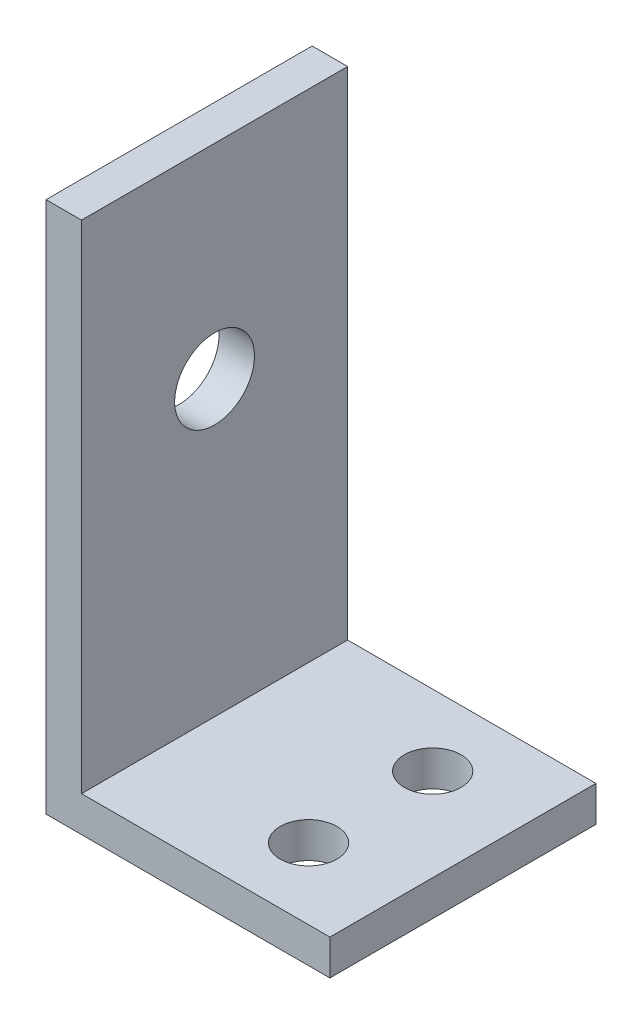
ISO-10303-21;
HEADER;
FILE_DESCRIPTION(('STEP AP214'),'2;1');
FILE_NAME('part.step','',(''),(''),'','','');
FILE_SCHEMA(('AUTOMOTIVE_DESIGN { 1 0 10303 214 1 1 1 1 }'));
ENDSEC;
DATA;
#1=APPLICATION_CONTEXT('core data for automotive mechanical design processes');
#2=APPLICATION_PROTOCOL_DEFINITION('international standard','automotive_design',2000,#1);
#3=PRODUCT_CONTEXT('',#1,'mechanical');
#4=PRODUCT('Part','Part','',(#3));
#5=PRODUCT_RELATED_PRODUCT_CATEGORY('part','',(#4));
#6=PRODUCT_DEFINITION_FORMATION('','',#4);
#7=PRODUCT_DEFINITION_CONTEXT('part definition',#1,'design');
#8=PRODUCT_DEFINITION('design','',#6,#7);
#9=PRODUCT_DEFINITION_SHAPE('','',#8);
#10=(LENGTH_UNIT() NAMED_UNIT(*) SI_UNIT(.MILLI.,.METRE.));
#11=(NAMED_UNIT(*) PLANE_ANGLE_UNIT() SI_UNIT($,.RADIAN.));
#12=(NAMED_UNIT(*) SI_UNIT($,.STERADIAN.) SOLID_ANGLE_UNIT());
#13=UNCERTAINTY_MEASURE_WITH_UNIT(LENGTH_MEASURE(1.E-05),#10,'distance_accuracy_value','');
#14=(GEOMETRIC_REPRESENTATION_CONTEXT(3) GLOBAL_UNCERTAINTY_ASSIGNED_CONTEXT((#13)) GLOBAL_UNIT_ASSIGNED_CONTEXT((#10,
#11,#12)) REPRESENTATION_CONTEXT('',''));
#15=CARTESIAN_POINT('',(0.,0.,0.));
#16=DIRECTION('',(0.,0.,1.));
#17=DIRECTION('',(1.,0.,0.));
#18=AXIS2_PLACEMENT_3D('',#15,#16,#17);
#19=CARTESIAN_POINT('',(-3.8235294117647,2.,-10.0882352941177));
#20=DIRECTION('',(1.,0.,0.));
#21=DIRECTION('',(0.,0.,-1.));
#22=AXIS2_PLACEMENT_3D('',#19,#20,#21);
#23=PLANE('',#22);
#24=CARTESIAN_POINT('',(-3.8235294117647,18.5,-2.58823529411765));
#25=DIRECTION('',(1.,0.,0.));
#26=DIRECTION('',(0.,0.,-1.));
#27=AXIS2_PLACEMENT_3D('',#24,#25,#26);
#28=CIRCLE('',#27,2.25);
#29=CARTESIAN_POINT('',(-3.8235294117647,18.5,-4.83823529411765));
#30=VERTEX_POINT('',#29);
#31=EDGE_CURVE('E164',#30,#30,#28,.T.);
#32=ORIENTED_EDGE('',*,*,#31,.T.);
#33=EDGE_LOOP('',(#32));
#34=FACE_BOUND('',#33,.T.);
#35=DIRECTION('',(0.,0.,1.));
#36=VECTOR('',#35,1.);
#37=CARTESIAN_POINT('',(-3.8235294117647,0.,-10.0882352941177));
#38=LINE('',#37,#36);
#39=CARTESIAN_POINT('',(-3.8235294117647,0.,-10.0882352941177));
#40=VERTEX_POINT('',#39);
#41=CARTESIAN_POINT('',(-3.8235294117647,0.,4.91176470588235));
#42=VERTEX_POINT('',#41);
#43=EDGE_CURVE('E91',#40,#42,#38,.T.);
#44=ORIENTED_EDGE('',*,*,#43,.T.);
#45=DIRECTION('',(0.,-1.,0.));
#46=VECTOR('',#45,1.);
#47=CARTESIAN_POINT('',(-3.8235294117647,2.,4.91176470588235));
#48=LINE('',#47,#46);
#49=CARTESIAN_POINT('',(-3.8235294117647,30.,4.91176470588235));
#50=VERTEX_POINT('',#49);
#51=EDGE_CURVE('E11',#50,#42,#48,.T.);
#52=ORIENTED_EDGE('',*,*,#51,.F.);
#53=DIRECTION('',(0.,0.,1.));
#54=VECTOR('',#53,1.);
#55=CARTESIAN_POINT('',(-3.8235294117647,30.,4.91176470588235));
#56=LINE('',#55,#54);
#57=CARTESIAN_POINT('',(-3.8235294117647,30.,-10.0882352941177));
#58=VERTEX_POINT('',#57);
#59=EDGE_CURVE('E93',#58,#50,#56,.T.);
#60=ORIENTED_EDGE('',*,*,#59,.F.);
#61=DIRECTION('',(0.,-1.,0.));
#62=VECTOR('',#61,1.);
#63=CARTESIAN_POINT('',(-3.8235294117647,2.,-10.0882352941177));
#64=LINE('',#63,#62);
#65=EDGE_CURVE('E77',#58,#40,#64,.T.);
#66=ORIENTED_EDGE('',*,*,#65,.T.);
#67=EDGE_LOOP('',(#44,#52,#60,#66));
#68=FACE_BOUND('',#67,.T.);
#69=ADVANCED_FACE('F33',(#34,#68),#23,.F.);
#70=CARTESIAN_POINT('',(-3.8235294117647,2.,4.91176470588235));
#71=DIRECTION('',(0.,0.,-1.));
#72=DIRECTION('',(-1.,0.,0.));
#73=AXIS2_PLACEMENT_3D('',#70,#71,#72);
#74=PLANE('',#73);
#75=DIRECTION('',(1.,0.,0.));
#76=VECTOR('',#75,1.);
#77=CARTESIAN_POINT('',(-3.8235294117647,0.,4.91176470588235));
#78=LINE('',#77,#76);
#79=CARTESIAN_POINT('',(12.1764705882353,0.,4.91176470588235));
#80=VERTEX_POINT('',#79);
#81=EDGE_CURVE('E97',#42,#80,#78,.T.);
#82=ORIENTED_EDGE('',*,*,#81,.T.);
#83=DIRECTION('',(0.,-1.,0.));
#84=VECTOR('',#83,1.);
#85=CARTESIAN_POINT('',(12.1764705882353,2.,4.91176470588235));
#86=LINE('',#85,#84);
#87=CARTESIAN_POINT('',(12.1764705882353,2.,4.91176470588235));
#88=VERTEX_POINT('',#87);
#89=EDGE_CURVE('E40',#88,#80,#86,.T.);
#90=ORIENTED_EDGE('',*,*,#89,.F.);
#91=DIRECTION('',(1.,0.,0.));
#92=VECTOR('',#91,1.);
#93=CARTESIAN_POINT('',(-3.8235294117647,2.,4.91176470588235));
#94=LINE('',#93,#92);
#95=CARTESIAN_POINT('',(-1.8235294117647,2.,4.91176470588235));
#96=VERTEX_POINT('',#95);
#97=EDGE_CURVE('E84',#96,#88,#94,.T.);
#98=ORIENTED_EDGE('',*,*,#97,.F.);
#99=DIRECTION('',(0.,-1.,0.));
#100=VECTOR('',#99,1.);
#101=CARTESIAN_POINT('',(-1.8235294117647,30.,4.91176470588235));
#102=LINE('',#101,#100);
#103=CARTESIAN_POINT('',(-1.8235294117647,30.,4.91176470588235));
#104=VERTEX_POINT('',#103);
#105=EDGE_CURVE('E98',#104,#96,#102,.T.);
#106=ORIENTED_EDGE('',*,*,#105,.F.);
#107=DIRECTION('',(1.,0.,0.));
#108=VECTOR('',#107,1.);
#109=CARTESIAN_POINT('',(-3.8235294117647,30.,4.91176470588235));
#110=LINE('',#109,#108);
#111=EDGE_CURVE('E118',#50,#104,#110,.T.);
#112=ORIENTED_EDGE('',*,*,#111,.F.);
#113=ORIENTED_EDGE('',*,*,#51,.T.);
#114=EDGE_LOOP('',(#82,#90,#98,#106,#112,#113));
#115=FACE_BOUND('',#114,.T.);
#116=ADVANCED_FACE('F113',(#115),#74,.F.);
#117=CARTESIAN_POINT('',(12.1764705882353,2.,-10.0882352941177));
#118=DIRECTION('',(-1.,0.,0.));
#119=DIRECTION('',(0.,0.,1.));
#120=AXIS2_PLACEMENT_3D('',#117,#118,#119);
#121=PLANE('',#120);
#122=DIRECTION('',(0.,0.,-1.));
#123=VECTOR('',#122,1.);
#124=CARTESIAN_POINT('',(12.1764705882353,0.,-10.0882352941177));
#125=LINE('',#124,#123);
#126=CARTESIAN_POINT('',(12.1764705882353,0.,-10.0882352941177));
#127=VERTEX_POINT('',#126);
#128=EDGE_CURVE('E85',#80,#127,#125,.T.);
#129=ORIENTED_EDGE('',*,*,#128,.T.);
#130=DIRECTION('',(0.,-1.,0.));
#131=VECTOR('',#130,1.);
#132=CARTESIAN_POINT('',(12.1764705882353,2.,-10.0882352941177));
#133=LINE('',#132,#131);
#134=CARTESIAN_POINT('',(12.1764705882353,2.,-10.0882352941177));
#135=VERTEX_POINT('',#134);
#136=EDGE_CURVE('E80',#135,#127,#133,.T.);
#137=ORIENTED_EDGE('',*,*,#136,.F.);
#138=DIRECTION('',(0.,0.,-1.));
#139=VECTOR('',#138,1.);
#140=CARTESIAN_POINT('',(12.1764705882353,2.,-10.0882352941177));
#141=LINE('',#140,#139);
#142=EDGE_CURVE('E53',#88,#135,#141,.T.);
#143=ORIENTED_EDGE('',*,*,#142,.F.);
#144=ORIENTED_EDGE('',*,*,#89,.T.);
#145=EDGE_LOOP('',(#129,#137,#143,#144));
#146=FACE_BOUND('',#145,.T.);
#147=ADVANCED_FACE('F111',(#146),#121,.F.);
#148=CARTESIAN_POINT('',(-3.8235294117647,2.,-10.0882352941177));
#149=DIRECTION('',(0.,0.,1.));
#150=DIRECTION('',(1.,0.,0.));
#151=AXIS2_PLACEMENT_3D('',#148,#149,#150);
#152=PLANE('',#151);
#153=DIRECTION('',(-1.,0.,0.));
#154=VECTOR('',#153,1.);
#155=CARTESIAN_POINT('',(-3.8235294117647,0.,-10.0882352941177));
#156=LINE('',#155,#154);
#157=EDGE_CURVE('E73',#127,#40,#156,.T.);
#158=ORIENTED_EDGE('',*,*,#157,.T.);
#159=ORIENTED_EDGE('',*,*,#65,.F.);
#160=DIRECTION('',(-1.,0.,0.));
#161=VECTOR('',#160,1.);
#162=CARTESIAN_POINT('',(-3.8235294117647,30.,-10.0882352941177));
#163=LINE('',#162,#161);
#164=CARTESIAN_POINT('',(-1.8235294117647,30.,-10.0882352941177));
#165=VERTEX_POINT('',#164);
#166=EDGE_CURVE('E132',#165,#58,#163,.T.);
#167=ORIENTED_EDGE('',*,*,#166,.F.);
#168=DIRECTION('',(0.,-1.,0.));
#169=VECTOR('',#168,1.);
#170=CARTESIAN_POINT('',(-1.8235294117647,30.,-10.0882352941177));
#171=LINE('',#170,#169);
#172=CARTESIAN_POINT('',(-1.8235294117647,2.,-10.0882352941177));
#173=VERTEX_POINT('',#172);
#174=EDGE_CURVE('E102',#165,#173,#171,.T.);
#175=ORIENTED_EDGE('',*,*,#174,.T.);
#176=DIRECTION('',(-1.,0.,0.));
#177=VECTOR('',#176,1.);
#178=CARTESIAN_POINT('',(-3.8235294117647,2.,-10.0882352941177));
#179=LINE('',#178,#177);
#180=EDGE_CURVE('E94',#135,#173,#179,.T.);
#181=ORIENTED_EDGE('',*,*,#180,.F.);
#182=ORIENTED_EDGE('',*,*,#136,.T.);
#183=EDGE_LOOP('',(#158,#159,#167,#175,#181,#182));
#184=FACE_BOUND('',#183,.T.);
#185=ADVANCED_FACE('F75',(#184),#152,.F.);
#186=CARTESIAN_POINT('',(0.,2.,0.));
#187=DIRECTION('',(0.,1.,0.));
#188=DIRECTION('',(0.,0.,1.));
#189=AXIS2_PLACEMENT_3D('',#186,#187,#188);
#190=PLANE('',#189);
#191=CARTESIAN_POINT('',(6.97282314750591,2.,-6.08823529411765));
#192=DIRECTION('',(0.,1.,0.));
#193=DIRECTION('',(0.,0.,1.));
#194=AXIS2_PLACEMENT_3D('',#191,#192,#193);
#195=CIRCLE('',#194,1.6);
#196=CARTESIAN_POINT('',(6.97282314750591,2.,-4.48823529411765));
#197=VERTEX_POINT('',#196);
#198=EDGE_CURVE('E166',#197,#197,#195,.T.);
#199=ORIENTED_EDGE('',*,*,#198,.F.);
#200=EDGE_LOOP('',(#199));
#201=FACE_BOUND('',#200,.T.);
#202=CARTESIAN_POINT('',(6.97282314750591,2.,0.91176470588235));
#203=DIRECTION('',(0.,1.,0.));
#204=DIRECTION('',(0.,0.,1.));
#205=AXIS2_PLACEMENT_3D('',#202,#203,#204);
#206=CIRCLE('',#205,1.6);
#207=CARTESIAN_POINT('',(6.97282314750591,2.,2.51176470588235));
#208=VERTEX_POINT('',#207);
#209=EDGE_CURVE('E177',#208,#208,#206,.T.);
#210=ORIENTED_EDGE('',*,*,#209,.F.);
#211=EDGE_LOOP('',(#210));
#212=FACE_BOUND('',#211,.T.);
#213=DIRECTION('',(0.,0.,-1.));
#214=VECTOR('',#213,1.);
#215=CARTESIAN_POINT('',(-1.8235294117647,2.,4.91176470588235));
#216=LINE('',#215,#214);
#217=EDGE_CURVE('E47',#96,#173,#216,.T.);
#218=ORIENTED_EDGE('',*,*,#217,.F.);
#219=ORIENTED_EDGE('',*,*,#97,.T.);
#220=ORIENTED_EDGE('',*,*,#142,.T.);
#221=ORIENTED_EDGE('',*,*,#180,.T.);
#222=EDGE_LOOP('',(#218,#219,#220,#221));
#223=FACE_BOUND('',#222,.T.);
#224=ADVANCED_FACE('F143',(#201,#212,#223),#190,.T.);
#225=CARTESIAN_POINT('',(0.,0.,0.));
#226=DIRECTION('',(0.,1.,0.));
#227=DIRECTION('',(0.,0.,1.));
#228=AXIS2_PLACEMENT_3D('',#225,#226,#227);
#229=PLANE('',#228);
#230=CARTESIAN_POINT('',(6.97282314750591,0.,-6.08823529411765));
#231=DIRECTION('',(0.,1.,0.));
#232=DIRECTION('',(0.,0.,1.));
#233=AXIS2_PLACEMENT_3D('',#230,#231,#232);
#234=CIRCLE('',#233,1.6);
#235=CARTESIAN_POINT('',(6.97282314750591,0.,-4.48823529411765));
#236=VERTEX_POINT('',#235);
#237=EDGE_CURVE('E170',#236,#236,#234,.T.);
#238=ORIENTED_EDGE('',*,*,#237,.T.);
#239=EDGE_LOOP('',(#238));
#240=FACE_BOUND('',#239,.T.);
#241=CARTESIAN_POINT('',(6.97282314750591,0.,0.91176470588235));
#242=DIRECTION('',(0.,1.,0.));
#243=DIRECTION('',(0.,0.,1.));
#244=AXIS2_PLACEMENT_3D('',#241,#242,#243);
#245=CIRCLE('',#244,1.6);
#246=CARTESIAN_POINT('',(6.97282314750591,0.,2.51176470588235));
#247=VERTEX_POINT('',#246);
#248=EDGE_CURVE('E141',#247,#247,#245,.T.);
#249=ORIENTED_EDGE('',*,*,#248,.T.);
#250=EDGE_LOOP('',(#249));
#251=FACE_BOUND('',#250,.T.);
#252=ORIENTED_EDGE('',*,*,#43,.F.);
#253=ORIENTED_EDGE('',*,*,#157,.F.);
#254=ORIENTED_EDGE('',*,*,#128,.F.);
#255=ORIENTED_EDGE('',*,*,#81,.F.);
#256=EDGE_LOOP('',(#252,#253,#254,#255));
#257=FACE_BOUND('',#256,.T.);
#258=ADVANCED_FACE('F96',(#240,#251,#257),#229,.F.);
#259=CARTESIAN_POINT('',(-1.8235294117647,30.,4.91176470588235));
#260=DIRECTION('',(-1.,0.,0.));
#261=DIRECTION('',(0.,0.,1.));
#262=AXIS2_PLACEMENT_3D('',#259,#260,#261);
#263=PLANE('',#262);
#264=CARTESIAN_POINT('',(-1.8235294117647,18.5,-2.58823529411765));
#265=DIRECTION('',(1.,0.,0.));
#266=DIRECTION('',(0.,0.,-1.));
#267=AXIS2_PLACEMENT_3D('',#264,#265,#266);
#268=CIRCLE('',#267,2.24999999999999);
#269=CARTESIAN_POINT('',(-1.8235294117647,18.5,-4.83823529411764));
#270=VERTEX_POINT('',#269);
#271=EDGE_CURVE('E167',#270,#270,#268,.T.);
#272=ORIENTED_EDGE('',*,*,#271,.F.);
#273=EDGE_LOOP('',(#272));
#274=FACE_BOUND('',#273,.T.);
#275=ORIENTED_EDGE('',*,*,#217,.T.);
#276=ORIENTED_EDGE('',*,*,#174,.F.);
#277=DIRECTION('',(0.,0.,-1.));
#278=VECTOR('',#277,1.);
#279=CARTESIAN_POINT('',(-1.8235294117647,30.,4.91176470588235));
#280=LINE('',#279,#278);
#281=EDGE_CURVE('E129',#104,#165,#280,.T.);
#282=ORIENTED_EDGE('',*,*,#281,.F.);
#283=ORIENTED_EDGE('',*,*,#105,.T.);
#284=EDGE_LOOP('',(#275,#276,#282,#283));
#285=FACE_BOUND('',#284,.T.);
#286=ADVANCED_FACE('F136',(#274,#285),#263,.F.);
#287=CARTESIAN_POINT('',(0.,30.,0.));
#288=DIRECTION('',(0.,-1.,0.));
#289=DIRECTION('',(0.,0.,-1.));
#290=AXIS2_PLACEMENT_3D('',#287,#288,#289);
#291=PLANE('',#290);
#292=ORIENTED_EDGE('',*,*,#59,.T.);
#293=ORIENTED_EDGE('',*,*,#111,.T.);
#294=ORIENTED_EDGE('',*,*,#281,.T.);
#295=ORIENTED_EDGE('',*,*,#166,.T.);
#296=EDGE_LOOP('',(#292,#293,#294,#295));
#297=FACE_BOUND('',#296,.T.);
#298=ADVANCED_FACE('F131',(#297),#291,.F.);
#299=CARTESIAN_POINT('',(6.97282314750591,2.,0.91176470588235));
#300=DIRECTION('',(0.,1.,0.));
#301=DIRECTION('',(0.,0.,1.));
#302=AXIS2_PLACEMENT_3D('',#299,#300,#301);
#303=CYLINDRICAL_SURFACE('',#302,1.6);
#304=ORIENTED_EDGE('',*,*,#248,.F.);
#305=EDGE_LOOP('',(#304));
#306=FACE_BOUND('',#305,.T.);
#307=ORIENTED_EDGE('',*,*,#209,.T.);
#308=EDGE_LOOP('',(#307));
#309=FACE_BOUND('',#308,.T.);
#310=ADVANCED_FACE('F185',(#306,#309),#303,.F.);
#311=CARTESIAN_POINT('',(6.97282314750591,2.,-6.08823529411765));
#312=DIRECTION('',(0.,1.,0.));
#313=DIRECTION('',(0.,0.,1.));
#314=AXIS2_PLACEMENT_3D('',#311,#312,#313);
#315=CYLINDRICAL_SURFACE('',#314,1.6);
#316=ORIENTED_EDGE('',*,*,#237,.F.);
#317=EDGE_LOOP('',(#316));
#318=FACE_BOUND('',#317,.T.);
#319=ORIENTED_EDGE('',*,*,#198,.T.);
#320=EDGE_LOOP('',(#319));
#321=FACE_BOUND('',#320,.T.);
#322=ADVANCED_FACE('F188',(#318,#321),#315,.F.);
#323=CARTESIAN_POINT('',(-1.8235294117647,18.5,-2.58823529411765));
#324=DIRECTION('',(1.,0.,0.));
#325=DIRECTION('',(0.,0.,-1.));
#326=AXIS2_PLACEMENT_3D('',#323,#324,#325);
#327=CYLINDRICAL_SURFACE('',#326,2.24999999999999);
#328=ORIENTED_EDGE('',*,*,#31,.F.);
#329=EDGE_LOOP('',(#328));
#330=FACE_BOUND('',#329,.T.);
#331=ORIENTED_EDGE('',*,*,#271,.T.);
#332=EDGE_LOOP('',(#331));
#333=FACE_BOUND('',#332,.T.);
#334=ADVANCED_FACE('F195',(#330,#333),#327,.F.);
#335=CLOSED_SHELL('',(#69,#116,#147,#185,#224,#258,#286,#298,#310,#322,#334));
#336=MANIFOLD_SOLID_BREP('B2',#335);
#337=ADVANCED_BREP_SHAPE_REPRESENTATION('',(#18,#336),#14);
#338=SHAPE_DEFINITION_REPRESENTATION(#9,#337);
ENDSEC;
END-ISO-10303-21;
